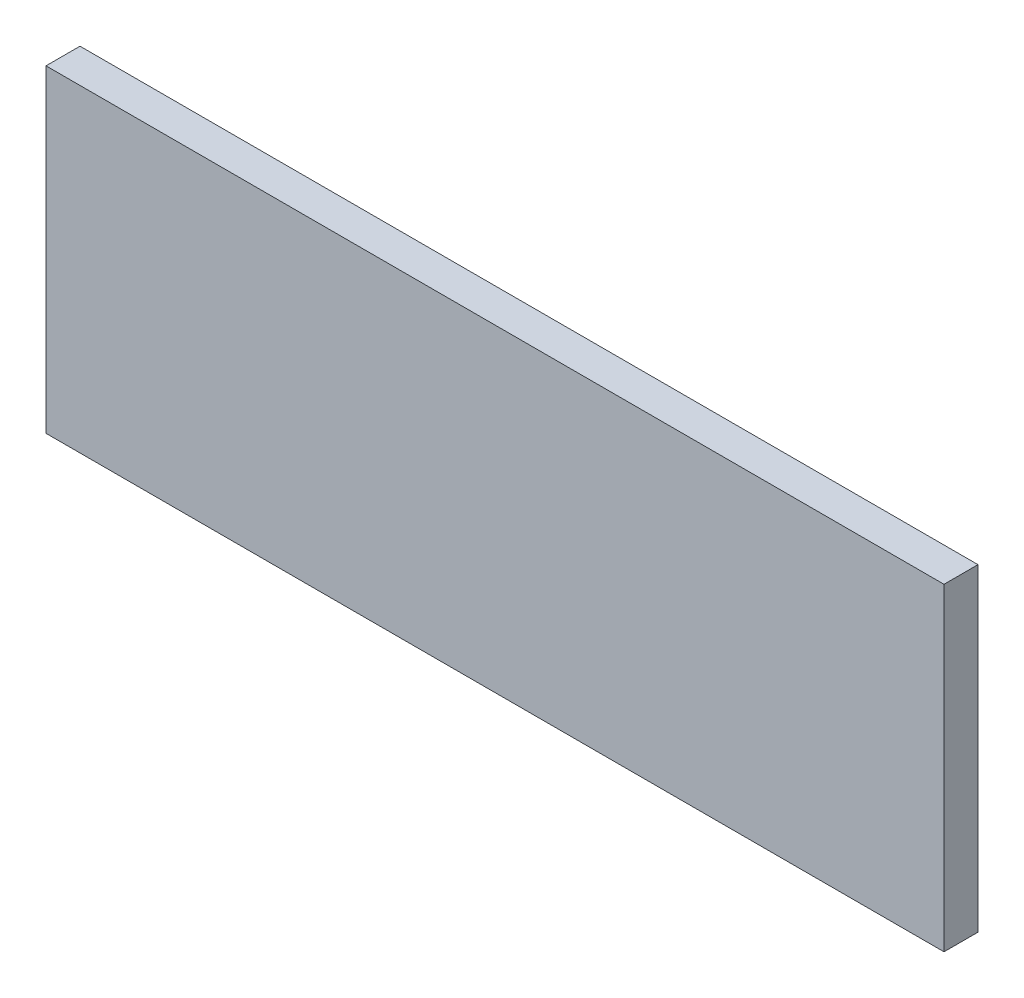
ISO-10303-21;
HEADER;
FILE_DESCRIPTION(('STEP AP214'),'2;1');
FILE_NAME('part.step','',(''),(''),'','','');
FILE_SCHEMA(('AUTOMOTIVE_DESIGN { 1 0 10303 214 1 1 1 1 }'));
ENDSEC;
DATA;
#1=APPLICATION_CONTEXT('core data for automotive mechanical design processes');
#2=APPLICATION_PROTOCOL_DEFINITION('international standard','automotive_design',2000,#1);
#3=PRODUCT_CONTEXT('',#1,'mechanical');
#4=PRODUCT('Part','Part','',(#3));
#5=PRODUCT_RELATED_PRODUCT_CATEGORY('part','',(#4));
#6=PRODUCT_DEFINITION_FORMATION('','',#4);
#7=PRODUCT_DEFINITION_CONTEXT('part definition',#1,'design');
#8=PRODUCT_DEFINITION('design','',#6,#7);
#9=PRODUCT_DEFINITION_SHAPE('','',#8);
#10=(LENGTH_UNIT() NAMED_UNIT(*) SI_UNIT(.MILLI.,.METRE.));
#11=(NAMED_UNIT(*) PLANE_ANGLE_UNIT() SI_UNIT($,.RADIAN.));
#12=(NAMED_UNIT(*) SI_UNIT($,.STERADIAN.) SOLID_ANGLE_UNIT());
#13=UNCERTAINTY_MEASURE_WITH_UNIT(LENGTH_MEASURE(1.E-05),#10,'distance_accuracy_value','');
#14=(GEOMETRIC_REPRESENTATION_CONTEXT(3) GLOBAL_UNCERTAINTY_ASSIGNED_CONTEXT((#13)) GLOBAL_UNIT_ASSIGNED_CONTEXT((#10,
#11,#12)) REPRESENTATION_CONTEXT('',''));
#15=CARTESIAN_POINT('',(0.,0.,0.));
#16=DIRECTION('',(0.,0.,1.));
#17=DIRECTION('',(1.,0.,0.));
#18=AXIS2_PLACEMENT_3D('',#15,#16,#17);
#19=CARTESIAN_POINT('',(33.5437221682158,11.8901671639391,2.54));
#20=DIRECTION('',(-1.,0.,0.));
#21=DIRECTION('',(0.,0.,1.));
#22=AXIS2_PLACEMENT_3D('',#19,#20,#21);
#23=PLANE('',#22);
#24=DIRECTION('',(0.,1.,0.));
#25=VECTOR('',#24,1.);
#26=CARTESIAN_POINT('',(33.5437221682158,11.8901671639391,0.));
#27=LINE('',#26,#25);
#28=CARTESIAN_POINT('',(33.5437221682158,-11.8901671639391,0.));
#29=VERTEX_POINT('',#28);
#30=CARTESIAN_POINT('',(33.5437221682158,11.8901671639391,0.));
#31=VERTEX_POINT('',#30);
#32=EDGE_CURVE('E96',#29,#31,#27,.T.);
#33=ORIENTED_EDGE('',*,*,#32,.T.);
#34=DIRECTION('',(0.,0.,-1.));
#35=VECTOR('',#34,1.);
#36=CARTESIAN_POINT('',(33.5437221682158,11.8901671639391,2.54));
#37=LINE('',#36,#35);
#38=CARTESIAN_POINT('',(33.5437221682158,11.8901671639391,2.54));
#39=VERTEX_POINT('',#38);
#40=EDGE_CURVE('E11',#39,#31,#37,.T.);
#41=ORIENTED_EDGE('',*,*,#40,.F.);
#42=DIRECTION('',(0.,1.,0.));
#43=VECTOR('',#42,1.);
#44=CARTESIAN_POINT('',(33.5437221682158,11.8901671639391,2.54));
#45=LINE('',#44,#43);
#46=CARTESIAN_POINT('',(33.5437221682158,-11.8901671639391,2.54));
#47=VERTEX_POINT('',#46);
#48=EDGE_CURVE('E84',#47,#39,#45,.T.);
#49=ORIENTED_EDGE('',*,*,#48,.F.);
#50=DIRECTION('',(0.,0.,-1.));
#51=VECTOR('',#50,1.);
#52=CARTESIAN_POINT('',(33.5437221682158,-11.8901671639391,2.54));
#53=LINE('',#52,#51);
#54=EDGE_CURVE('E92',#47,#29,#53,.T.);
#55=ORIENTED_EDGE('',*,*,#54,.T.);
#56=EDGE_LOOP('',(#33,#41,#49,#55));
#57=FACE_BOUND('',#56,.T.);
#58=ADVANCED_FACE('F33',(#57),#23,.F.);
#59=CARTESIAN_POINT('',(-33.5437221682158,11.8901671639391,2.54));
#60=DIRECTION('',(0.,-1.,0.));
#61=DIRECTION('',(0.,0.,-1.));
#62=AXIS2_PLACEMENT_3D('',#59,#60,#61);
#63=PLANE('',#62);
#64=DIRECTION('',(-1.,0.,0.));
#65=VECTOR('',#64,1.);
#66=CARTESIAN_POINT('',(-33.5437221682158,11.8901671639391,0.));
#67=LINE('',#66,#65);
#68=CARTESIAN_POINT('',(-33.5437221682158,11.8901671639391,0.));
#69=VERTEX_POINT('',#68);
#70=EDGE_CURVE('E88',#31,#69,#67,.T.);
#71=ORIENTED_EDGE('',*,*,#70,.T.);
#72=DIRECTION('',(0.,0.,-1.));
#73=VECTOR('',#72,1.);
#74=CARTESIAN_POINT('',(-33.5437221682158,11.8901671639391,2.54));
#75=LINE('',#74,#73);
#76=CARTESIAN_POINT('',(-33.5437221682158,11.8901671639391,2.54));
#77=VERTEX_POINT('',#76);
#78=EDGE_CURVE('E41',#77,#69,#75,.T.);
#79=ORIENTED_EDGE('',*,*,#78,.F.);
#80=DIRECTION('',(-1.,0.,0.));
#81=VECTOR('',#80,1.);
#82=CARTESIAN_POINT('',(-33.5437221682158,11.8901671639391,2.54));
#83=LINE('',#82,#81);
#84=EDGE_CURVE('E79',#39,#77,#83,.T.);
#85=ORIENTED_EDGE('',*,*,#84,.F.);
#86=ORIENTED_EDGE('',*,*,#40,.T.);
#87=EDGE_LOOP('',(#71,#79,#85,#86));
#88=FACE_BOUND('',#87,.T.);
#89=ADVANCED_FACE('F87',(#88),#63,.F.);
#90=CARTESIAN_POINT('',(-33.5437221682158,11.8901671639391,2.54));
#91=DIRECTION('',(1.,0.,0.));
#92=DIRECTION('',(0.,0.,-1.));
#93=AXIS2_PLACEMENT_3D('',#90,#91,#92);
#94=PLANE('',#93);
#95=DIRECTION('',(0.,-1.,0.));
#96=VECTOR('',#95,1.);
#97=CARTESIAN_POINT('',(-33.5437221682158,11.8901671639391,0.));
#98=LINE('',#97,#96);
#99=CARTESIAN_POINT('',(-33.5437221682158,-11.8901671639391,0.));
#100=VERTEX_POINT('',#99);
#101=EDGE_CURVE('E66',#69,#100,#98,.T.);
#102=ORIENTED_EDGE('',*,*,#101,.T.);
#103=DIRECTION('',(0.,0.,-1.));
#104=VECTOR('',#103,1.);
#105=CARTESIAN_POINT('',(-33.5437221682158,-11.8901671639391,2.54));
#106=LINE('',#105,#104);
#107=CARTESIAN_POINT('',(-33.5437221682158,-11.8901671639391,2.54));
#108=VERTEX_POINT('',#107);
#109=EDGE_CURVE('E89',#108,#100,#106,.T.);
#110=ORIENTED_EDGE('',*,*,#109,.F.);
#111=DIRECTION('',(0.,-1.,0.));
#112=VECTOR('',#111,1.);
#113=CARTESIAN_POINT('',(-33.5437221682158,11.8901671639391,2.54));
#114=LINE('',#113,#112);
#115=EDGE_CURVE('E82',#77,#108,#114,.T.);
#116=ORIENTED_EDGE('',*,*,#115,.F.);
#117=ORIENTED_EDGE('',*,*,#78,.T.);
#118=EDGE_LOOP('',(#102,#110,#116,#117));
#119=FACE_BOUND('',#118,.T.);
#120=ADVANCED_FACE('F90',(#119),#94,.F.);
#121=CARTESIAN_POINT('',(-33.5437221682158,-11.8901671639391,2.54));
#122=DIRECTION('',(0.,1.,0.));
#123=DIRECTION('',(0.,0.,1.));
#124=AXIS2_PLACEMENT_3D('',#121,#122,#123);
#125=PLANE('',#124);
#126=DIRECTION('',(1.,0.,0.));
#127=VECTOR('',#126,1.);
#128=CARTESIAN_POINT('',(-33.5437221682158,-11.8901671639391,0.));
#129=LINE('',#128,#127);
#130=EDGE_CURVE('E72',#100,#29,#129,.T.);
#131=ORIENTED_EDGE('',*,*,#130,.T.);
#132=ORIENTED_EDGE('',*,*,#54,.F.);
#133=DIRECTION('',(1.,0.,0.));
#134=VECTOR('',#133,1.);
#135=CARTESIAN_POINT('',(-33.5437221682158,-11.8901671639391,2.54));
#136=LINE('',#135,#134);
#137=EDGE_CURVE('E49',#108,#47,#136,.T.);
#138=ORIENTED_EDGE('',*,*,#137,.F.);
#139=ORIENTED_EDGE('',*,*,#109,.T.);
#140=EDGE_LOOP('',(#131,#132,#138,#139));
#141=FACE_BOUND('',#140,.T.);
#142=ADVANCED_FACE('F103',(#141),#125,.F.);
#143=CARTESIAN_POINT('',(0.,0.,2.54));
#144=DIRECTION('',(0.,0.,1.));
#145=DIRECTION('',(1.,0.,0.));
#146=AXIS2_PLACEMENT_3D('',#143,#144,#145);
#147=PLANE('',#146);
#148=ORIENTED_EDGE('',*,*,#48,.T.);
#149=ORIENTED_EDGE('',*,*,#84,.T.);
#150=ORIENTED_EDGE('',*,*,#115,.T.);
#151=ORIENTED_EDGE('',*,*,#137,.T.);
#152=EDGE_LOOP('',(#148,#149,#150,#151));
#153=FACE_BOUND('',#152,.T.);
#154=ADVANCED_FACE('F80',(#153),#147,.T.);
#155=CARTESIAN_POINT('',(0.,0.,0.));
#156=DIRECTION('',(0.,0.,1.));
#157=DIRECTION('',(1.,0.,0.));
#158=AXIS2_PLACEMENT_3D('',#155,#156,#157);
#159=PLANE('',#158);
#160=ORIENTED_EDGE('',*,*,#32,.F.);
#161=ORIENTED_EDGE('',*,*,#130,.F.);
#162=ORIENTED_EDGE('',*,*,#101,.F.);
#163=ORIENTED_EDGE('',*,*,#70,.F.);
#164=EDGE_LOOP('',(#160,#161,#162,#163));
#165=FACE_BOUND('',#164,.T.);
#166=ADVANCED_FACE('F106',(#165),#159,.F.);
#167=CLOSED_SHELL('',(#58,#89,#120,#142,#154,#166));
#168=MANIFOLD_SOLID_BREP('B2',#167);
#169=ADVANCED_BREP_SHAPE_REPRESENTATION('',(#18,#168),#14);
#170=SHAPE_DEFINITION_REPRESENTATION(#9,#169);
ENDSEC;
END-ISO-10303-21;
